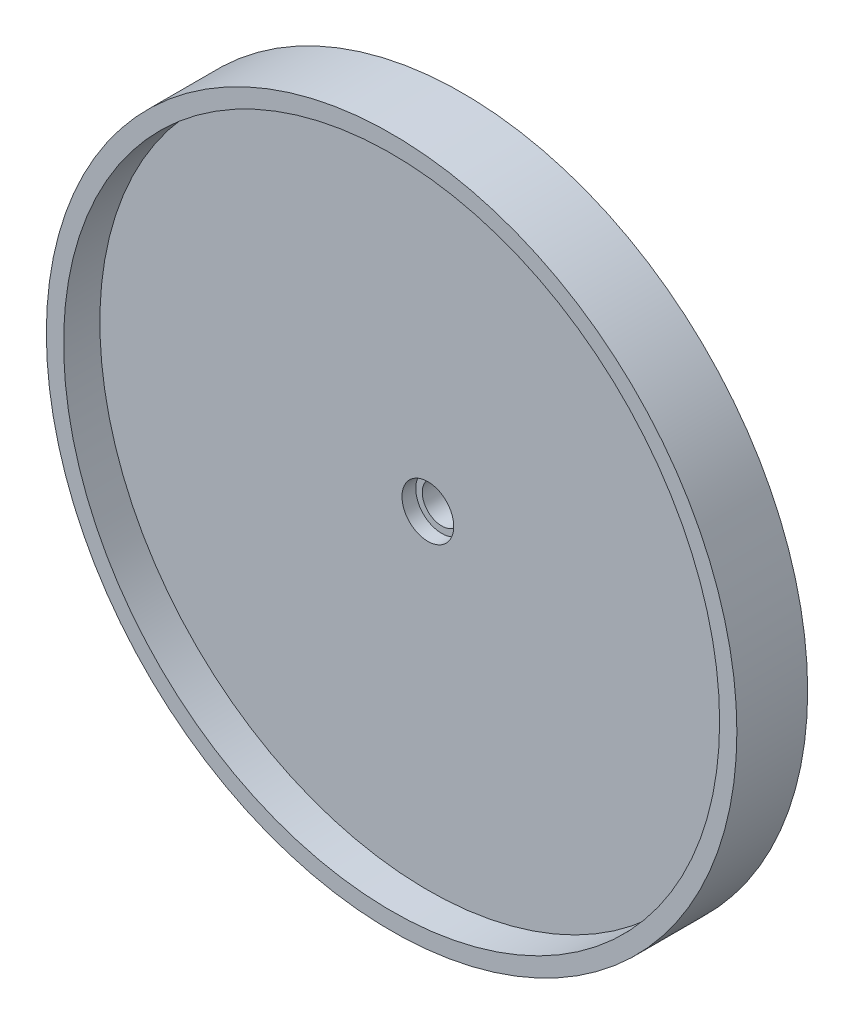
ISO-10303-21;
HEADER;
FILE_DESCRIPTION(('STEP AP214'),'2;1');
FILE_NAME('part.step','',(''),(''),'','','');
FILE_SCHEMA(('AUTOMOTIVE_DESIGN { 1 0 10303 214 1 1 1 1 }'));
ENDSEC;
DATA;
#1=APPLICATION_CONTEXT('core data for automotive mechanical design processes');
#2=APPLICATION_PROTOCOL_DEFINITION('international standard','automotive_design',2000,#1);
#3=PRODUCT_CONTEXT('',#1,'mechanical');
#4=PRODUCT('Part','Part','',(#3));
#5=PRODUCT_RELATED_PRODUCT_CATEGORY('part','',(#4));
#6=PRODUCT_DEFINITION_FORMATION('','',#4);
#7=PRODUCT_DEFINITION_CONTEXT('part definition',#1,'design');
#8=PRODUCT_DEFINITION('design','',#6,#7);
#9=PRODUCT_DEFINITION_SHAPE('','',#8);
#10=(LENGTH_UNIT() NAMED_UNIT(*) SI_UNIT(.MILLI.,.METRE.));
#11=(NAMED_UNIT(*) PLANE_ANGLE_UNIT() SI_UNIT($,.RADIAN.));
#12=(NAMED_UNIT(*) SI_UNIT($,.STERADIAN.) SOLID_ANGLE_UNIT());
#13=UNCERTAINTY_MEASURE_WITH_UNIT(LENGTH_MEASURE(1.E-05),#10,'distance_accuracy_value','');
#14=(GEOMETRIC_REPRESENTATION_CONTEXT(3) GLOBAL_UNCERTAINTY_ASSIGNED_CONTEXT((#13)) GLOBAL_UNIT_ASSIGNED_CONTEXT((#10,
#11,#12)) REPRESENTATION_CONTEXT('',''));
#15=CARTESIAN_POINT('',(0.,0.,0.));
#16=DIRECTION('',(0.,0.,1.));
#17=DIRECTION('',(1.,0.,0.));
#18=AXIS2_PLACEMENT_3D('',#15,#16,#17);
#19=CARTESIAN_POINT('',(0.,0.,-13.017512));
#20=DIRECTION('',(0.,0.,1.));
#21=DIRECTION('',(1.,0.,0.));
#22=AXIS2_PLACEMENT_3D('',#19,#20,#21);
#23=CYLINDRICAL_SURFACE('',#22,3.571875);
#24=CARTESIAN_POINT('',(0.,0.,-13.0175));
#25=DIRECTION('',(0.,0.,1.));
#26=DIRECTION('',(1.,0.,0.));
#27=AXIS2_PLACEMENT_3D('',#24,#25,#26);
#28=CIRCLE('',#27,3.571875);
#29=CARTESIAN_POINT('',(3.571875,0.,-13.0175));
#30=VERTEX_POINT('',#29);
#31=EDGE_CURVE('E50',#30,#30,#28,.F.);
#32=CARTESIAN_POINT('',(0.,0.,-9.2075));
#33=DIRECTION('',(0.,0.,1.));
#34=DIRECTION('',(1.,0.,0.));
#35=AXIS2_PLACEMENT_3D('',#32,#33,#34);
#36=CIRCLE('',#35,3.571875);
#37=CARTESIAN_POINT('',(3.571875,0.,-9.2075));
#38=VERTEX_POINT('',#37);
#39=EDGE_CURVE('E38',#38,#38,#36,.T.);
#40=CARTESIAN_POINT('',(3.571875,0.,-13.0175));
#41=CARTESIAN_POINT('',(3.571875,0.,-12.9778125));
#42=CARTESIAN_POINT('',(3.571875,0.,-12.938125));
#43=CARTESIAN_POINT('',(3.571875,0.,-12.85875));
#44=CARTESIAN_POINT('',(3.571875,0.,-12.8190625));
#45=CARTESIAN_POINT('',(3.571875,0.,-12.7396875));
#46=CARTESIAN_POINT('',(3.571875,0.,-12.7));
#47=CARTESIAN_POINT('',(3.571875,0.,-12.620625));
#48=CARTESIAN_POINT('',(3.571875,0.,-12.5809375));
#49=CARTESIAN_POINT('',(3.571875,0.,-12.5015625));
#50=CARTESIAN_POINT('',(3.571875,0.,-12.461875));
#51=CARTESIAN_POINT('',(3.571875,0.,-12.3825));
#52=CARTESIAN_POINT('',(3.571875,0.,-12.3428125));
#53=CARTESIAN_POINT('',(3.571875,0.,-12.2634375));
#54=CARTESIAN_POINT('',(3.571875,0.,-12.22375));
#55=CARTESIAN_POINT('',(3.571875,0.,-12.144375));
#56=CARTESIAN_POINT('',(3.571875,0.,-12.1046875));
#57=CARTESIAN_POINT('',(3.571875,0.,-12.0253125));
#58=CARTESIAN_POINT('',(3.571875,0.,-11.985625));
#59=CARTESIAN_POINT('',(3.571875,0.,-11.90625));
#60=CARTESIAN_POINT('',(3.571875,0.,-11.8665625));
#61=CARTESIAN_POINT('',(3.571875,0.,-11.7871875));
#62=CARTESIAN_POINT('',(3.571875,0.,-11.7475));
#63=CARTESIAN_POINT('',(3.571875,0.,-11.668125));
#64=CARTESIAN_POINT('',(3.571875,0.,-11.6284375));
#65=CARTESIAN_POINT('',(3.571875,0.,-11.5490625));
#66=CARTESIAN_POINT('',(3.571875,0.,-11.509375));
#67=CARTESIAN_POINT('',(3.571875,0.,-11.43));
#68=CARTESIAN_POINT('',(3.571875,0.,-11.3903125));
#69=CARTESIAN_POINT('',(3.571875,0.,-11.3109375));
#70=CARTESIAN_POINT('',(3.571875,0.,-11.27125));
#71=CARTESIAN_POINT('',(3.571875,0.,-11.191875));
#72=CARTESIAN_POINT('',(3.571875,0.,-11.1521875));
#73=CARTESIAN_POINT('',(3.571875,0.,-11.0728125));
#74=CARTESIAN_POINT('',(3.571875,0.,-11.033125));
#75=CARTESIAN_POINT('',(3.571875,0.,-10.95375));
#76=CARTESIAN_POINT('',(3.571875,0.,-10.9140625));
#77=CARTESIAN_POINT('',(3.571875,0.,-10.8346875));
#78=CARTESIAN_POINT('',(3.571875,0.,-10.795));
#79=CARTESIAN_POINT('',(3.571875,0.,-10.715625));
#80=CARTESIAN_POINT('',(3.571875,0.,-10.6759375));
#81=CARTESIAN_POINT('',(3.571875,0.,-10.5965625));
#82=CARTESIAN_POINT('',(3.571875,0.,-10.556875));
#83=CARTESIAN_POINT('',(3.571875,0.,-10.4775));
#84=CARTESIAN_POINT('',(3.571875,0.,-10.4378125));
#85=CARTESIAN_POINT('',(3.571875,0.,-10.3584375));
#86=CARTESIAN_POINT('',(3.571875,0.,-10.31875));
#87=CARTESIAN_POINT('',(3.571875,0.,-10.239375));
#88=CARTESIAN_POINT('',(3.571875,0.,-10.1996875));
#89=CARTESIAN_POINT('',(3.571875,0.,-10.1203125));
#90=CARTESIAN_POINT('',(3.571875,0.,-10.080625));
#91=CARTESIAN_POINT('',(3.571875,0.,-10.00125));
#92=CARTESIAN_POINT('',(3.571875,0.,-9.9615625));
#93=CARTESIAN_POINT('',(3.571875,0.,-9.8821875));
#94=CARTESIAN_POINT('',(3.571875,0.,-9.8425));
#95=CARTESIAN_POINT('',(3.571875,0.,-9.763125));
#96=CARTESIAN_POINT('',(3.571875,0.,-9.7234375));
#97=CARTESIAN_POINT('',(3.571875,0.,-9.6440625));
#98=CARTESIAN_POINT('',(3.571875,0.,-9.604375));
#99=CARTESIAN_POINT('',(3.571875,0.,-9.525));
#100=CARTESIAN_POINT('',(3.571875,0.,-9.4853125));
#101=CARTESIAN_POINT('',(3.571875,0.,-9.4059375));
#102=CARTESIAN_POINT('',(3.571875,0.,-9.36625));
#103=CARTESIAN_POINT('',(3.571875,0.,-9.286875));
#104=CARTESIAN_POINT('',(3.571875,0.,-9.2471875));
#105=CARTESIAN_POINT('',(3.571875,0.,-9.2075));
#106=B_SPLINE_CURVE_WITH_KNOTS('',3,(#40,#41,#42,#43,#44,#45,#46,#47,#48,#49,#50,#51,#52,#53,
#54,#55,#56,#57,#58,#59,#60,#61,#62,#63,#64,#65,#66,#67,#68,#69,#70,#71,#72,#73,#74,#75,#76,#77,
#78,#79,#80,#81,#82,#83,#84,#85,#86,#87,#88,#89,#90,#91,#92,#93,#94,#95,#96,#97,#98,#99,#100,
#101,#102,#103,#104,#105),.UNSPECIFIED.,.F.,.F.,(4,2,2,2,2,2,2,2,2,2,2,2,2,2,2,2,2,2,2,2,2,2,2,
2,2,2,2,2,2,2,2,2,4),(0.,0.119062500000001,0.238125,0.357187500000002,0.476250000000001,
0.595312500000002,0.714375000000001,0.833437500000001,0.952500000000002,1.0715625,1.190625,
1.3096875,1.42875,1.5478125,1.666875,1.7859375,1.905,2.0240625,2.143125,2.2621875,2.38125,
2.5003125,2.619375,2.7384375,2.8575,2.9765625,3.095625,3.2146875,3.33375,3.4528125,3.571875,
3.6909375,3.81),.UNSPECIFIED.);
#107=EDGE_CURVE('BSEAM34',#30,#38,#106,.T.);
#108=ORIENTED_EDGE('',*,*,#31,.T.);
#109=ORIENTED_EDGE('',*,*,#39,.T.);
#110=ORIENTED_EDGE('',*,*,#107,.T.);
#111=ORIENTED_EDGE('',*,*,#107,.F.);
#112=EDGE_LOOP('',(#108,#110,#109,#111));
#113=FACE_BOUND('',#112,.T.);
#114=ADVANCED_FACE('F34',(#113),#23,.F.);
#115=CARTESIAN_POINT('',(0.,0.,40.5335329341318));
#116=DIRECTION('',(0.,0.,1.));
#117=DIRECTION('',(1.,0.,0.));
#118=AXIS2_PLACEMENT_3D('',#115,#116,#117);
#119=CYLINDRICAL_SURFACE('',#118,63.5);
#120=CARTESIAN_POINT('',(0.,0.,0.));
#121=DIRECTION('',(0.,0.,1.));
#122=DIRECTION('',(1.,0.,0.));
#123=AXIS2_PLACEMENT_3D('',#120,#121,#122);
#124=CIRCLE('',#123,63.5);
#125=CARTESIAN_POINT('',(63.5,0.,0.));
#126=VERTEX_POINT('',#125);
#127=EDGE_CURVE('E10',#126,#126,#124,.T.);
#128=ORIENTED_EDGE('',*,*,#127,.F.);
#129=EDGE_LOOP('',(#128));
#130=FACE_BOUND('',#129,.T.);
#131=CARTESIAN_POINT('',(0.,0.,-13.0175));
#132=DIRECTION('',(0.,0.,1.));
#133=DIRECTION('',(1.,0.,0.));
#134=AXIS2_PLACEMENT_3D('',#131,#132,#133);
#135=CIRCLE('',#134,63.5);
#136=CARTESIAN_POINT('',(63.5,0.,-13.0175));
#137=VERTEX_POINT('',#136);
#138=EDGE_CURVE('E52',#137,#137,#135,.T.);
#139=ORIENTED_EDGE('',*,*,#138,.T.);
#140=EDGE_LOOP('',(#139));
#141=FACE_BOUND('',#140,.T.);
#142=ADVANCED_FACE('F36',(#130,#141),#119,.T.);
#143=CARTESIAN_POINT('',(0.,63.5,0.));
#144=DIRECTION('',(0.,0.,-1.));
#145=DIRECTION('',(-1.,0.,0.));
#146=AXIS2_PLACEMENT_3D('',#143,#144,#145);
#147=PLANE('',#146);
#148=CARTESIAN_POINT('',(0.,0.,0.));
#149=DIRECTION('',(0.,0.,1.));
#150=DIRECTION('',(1.,0.,0.));
#151=AXIS2_PLACEMENT_3D('',#148,#149,#150);
#152=CIRCLE('',#151,60.325);
#153=CARTESIAN_POINT('',(60.325,0.,0.));
#154=VERTEX_POINT('',#153);
#155=EDGE_CURVE('E42',#154,#154,#152,.T.);
#156=ORIENTED_EDGE('',*,*,#155,.F.);
#157=EDGE_LOOP('',(#156));
#158=FACE_BOUND('',#157,.T.);
#159=ORIENTED_EDGE('',*,*,#127,.T.);
#160=EDGE_LOOP('',(#159));
#161=FACE_BOUND('',#160,.T.);
#162=ADVANCED_FACE('F76',(#158,#161),#147,.F.);
#163=CARTESIAN_POINT('',(0.,0.,40.5335329341318));
#164=DIRECTION('',(0.,0.,1.));
#165=DIRECTION('',(1.,0.,0.));
#166=AXIS2_PLACEMENT_3D('',#163,#164,#165);
#167=CYLINDRICAL_SURFACE('',#166,60.325);
#168=CARTESIAN_POINT('',(0.,0.,-6.66749999999999));
#169=DIRECTION('',(0.,0.,1.));
#170=DIRECTION('',(1.,0.,0.));
#171=AXIS2_PLACEMENT_3D('',#168,#169,#170);
#172=CIRCLE('',#171,60.325);
#173=CARTESIAN_POINT('',(60.325,0.,-6.66749999999999));
#174=VERTEX_POINT('',#173);
#175=EDGE_CURVE('E47',#174,#174,#172,.T.);
#176=ORIENTED_EDGE('',*,*,#175,.F.);
#177=EDGE_LOOP('',(#176));
#178=FACE_BOUND('',#177,.T.);
#179=ORIENTED_EDGE('',*,*,#155,.T.);
#180=EDGE_LOOP('',(#179));
#181=FACE_BOUND('',#180,.T.);
#182=ADVANCED_FACE('F73',(#178,#181),#167,.F.);
#183=CARTESIAN_POINT('',(0.,60.325,-6.66749999999999));
#184=DIRECTION('',(0.,0.,-1.));
#185=DIRECTION('',(-1.,0.,0.));
#186=AXIS2_PLACEMENT_3D('',#183,#184,#185);
#187=PLANE('',#186);
#188=CARTESIAN_POINT('',(0.,0.,-6.66749999999999));
#189=DIRECTION('',(0.,0.,1.));
#190=DIRECTION('',(1.,0.,0.));
#191=AXIS2_PLACEMENT_3D('',#188,#189,#190);
#192=CIRCLE('',#191,4.7625);
#193=CARTESIAN_POINT('',(4.7625,0.,-6.66749999999999));
#194=VERTEX_POINT('',#193);
#195=EDGE_CURVE('E62',#194,#194,#192,.T.);
#196=ORIENTED_EDGE('',*,*,#195,.F.);
#197=EDGE_LOOP('',(#196));
#198=FACE_BOUND('',#197,.T.);
#199=ORIENTED_EDGE('',*,*,#175,.T.);
#200=EDGE_LOOP('',(#199));
#201=FACE_BOUND('',#200,.T.);
#202=ADVANCED_FACE('F71',(#198,#201),#187,.F.);
#203=CARTESIAN_POINT('',(0.,0.,-13.0175));
#204=DIRECTION('',(0.,0.,1.));
#205=DIRECTION('',(1.,0.,0.));
#206=AXIS2_PLACEMENT_3D('',#203,#204,#205);
#207=PLANE('',#206);
#208=ORIENTED_EDGE('',*,*,#31,.F.);
#209=EDGE_LOOP('',(#208));
#210=FACE_BOUND('',#209,.T.);
#211=ORIENTED_EDGE('',*,*,#138,.F.);
#212=EDGE_LOOP('',(#211));
#213=FACE_BOUND('',#212,.T.);
#214=ADVANCED_FACE('F93',(#210,#213),#207,.F.);
#215=CARTESIAN_POINT('',(0.,0.,-9.2075));
#216=DIRECTION('',(0.,0.,1.));
#217=DIRECTION('',(1.,0.,0.));
#218=AXIS2_PLACEMENT_3D('',#215,#216,#217);
#219=CYLINDRICAL_SURFACE('',#218,4.7625);
#220=CARTESIAN_POINT('',(0.,0.,-9.2075));
#221=DIRECTION('',(0.,0.,1.));
#222=DIRECTION('',(1.,0.,0.));
#223=AXIS2_PLACEMENT_3D('',#220,#221,#222);
#224=CIRCLE('',#223,4.7625);
#225=CARTESIAN_POINT('',(4.7625,0.,-9.2075));
#226=VERTEX_POINT('',#225);
#227=EDGE_CURVE('E58',#226,#226,#224,.T.);
#228=ORIENTED_EDGE('',*,*,#227,.F.);
#229=EDGE_LOOP('',(#228));
#230=FACE_BOUND('',#229,.T.);
#231=ORIENTED_EDGE('',*,*,#195,.T.);
#232=EDGE_LOOP('',(#231));
#233=FACE_BOUND('',#232,.T.);
#234=ADVANCED_FACE('F91',(#230,#233),#219,.F.);
#235=CARTESIAN_POINT('',(0.,0.,-9.2075));
#236=DIRECTION('',(0.,0.,1.));
#237=DIRECTION('',(1.,0.,0.));
#238=AXIS2_PLACEMENT_3D('',#235,#236,#237);
#239=PLANE('',#238);
#240=ORIENTED_EDGE('',*,*,#39,.F.);
#241=EDGE_LOOP('',(#240));
#242=FACE_BOUND('',#241,.T.);
#243=ORIENTED_EDGE('',*,*,#227,.T.);
#244=EDGE_LOOP('',(#243));
#245=FACE_BOUND('',#244,.T.);
#246=ADVANCED_FACE('F104',(#242,#245),#239,.T.);
#247=CLOSED_SHELL('',(#114,#142,#162,#182,#202,#214,#234,#246));
#248=MANIFOLD_SOLID_BREP('B2',#247);
#249=ADVANCED_BREP_SHAPE_REPRESENTATION('',(#18,#248),#14);
#250=SHAPE_DEFINITION_REPRESENTATION(#9,#249);
ENDSEC;
END-ISO-10303-21;
